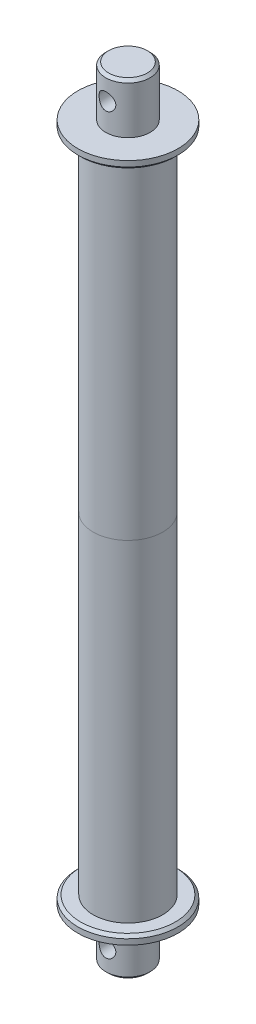
ISO-10303-21;
HEADER;
FILE_DESCRIPTION(('STEP AP214'),'2;1');
FILE_NAME('part.step','',(''),(''),'','','');
FILE_SCHEMA(('AUTOMOTIVE_DESIGN { 1 0 10303 214 1 1 1 1 }'));
ENDSEC;
DATA;
#1=APPLICATION_CONTEXT('core data for automotive mechanical design processes');
#2=APPLICATION_PROTOCOL_DEFINITION('international standard','automotive_design',2000,#1);
#3=PRODUCT_CONTEXT('',#1,'mechanical');
#4=PRODUCT('Part','Part','',(#3));
#5=PRODUCT_RELATED_PRODUCT_CATEGORY('part','',(#4));
#6=PRODUCT_DEFINITION_FORMATION('','',#4);
#7=PRODUCT_DEFINITION_CONTEXT('part definition',#1,'design');
#8=PRODUCT_DEFINITION('design','',#6,#7);
#9=PRODUCT_DEFINITION_SHAPE('','',#8);
#10=(LENGTH_UNIT() NAMED_UNIT(*) SI_UNIT(.MILLI.,.METRE.));
#11=(NAMED_UNIT(*) PLANE_ANGLE_UNIT() SI_UNIT($,.RADIAN.));
#12=(NAMED_UNIT(*) SI_UNIT($,.STERADIAN.) SOLID_ANGLE_UNIT());
#13=UNCERTAINTY_MEASURE_WITH_UNIT(LENGTH_MEASURE(1.E-05),#10,'distance_accuracy_value','');
#14=(GEOMETRIC_REPRESENTATION_CONTEXT(3) GLOBAL_UNCERTAINTY_ASSIGNED_CONTEXT((#13)) GLOBAL_UNIT_ASSIGNED_CONTEXT((#10,
#11,#12)) REPRESENTATION_CONTEXT('',''));
#15=CARTESIAN_POINT('',(0.,0.,0.));
#16=DIRECTION('',(0.,0.,1.));
#17=DIRECTION('',(1.,0.,0.));
#18=AXIS2_PLACEMENT_3D('',#15,#16,#17);
#19=CARTESIAN_POINT('',(0.,-262.,0.));
#20=DIRECTION('',(0.,1.,0.));
#21=DIRECTION('',(0.,0.,-1.));
#22=AXIS2_PLACEMENT_3D('',#19,#20,#21);
#23=CYLINDRICAL_SURFACE('',#22,7.95);
#24=CARTESIAN_POINT('',(0.,-256.7,-7.95));
#25=CARTESIAN_POINT('',(-0.162397491346749,-256.700006155822,-7.95000463305476));
#26=CARTESIAN_POINT('',(-0.324753099848187,-256.686772434708,-7.94498084128038));
#27=CARTESIAN_POINT('',(-0.644608276496751,-256.634404688573,-7.92544254710234));
#28=CARTESIAN_POINT('',(-0.802108607238708,-256.595274752861,-7.91092954315816));
#29=CARTESIAN_POINT('',(-1.10759384707585,-256.49269822242,-7.87396945860854));
#30=CARTESIAN_POINT('',(-1.25559660387506,-256.429298895846,-7.85153780728387));
#31=CARTESIAN_POINT('',(-1.53885384506538,-256.280225253955,-7.80097147100144));
#32=CARTESIAN_POINT('',(-1.67410485143574,-256.194544885329,-7.77283523668181));
#33=CARTESIAN_POINT('',(-1.93382546780258,-255.999501100852,-7.7124114666644));
#34=CARTESIAN_POINT('',(-2.0576753838472,-255.889349562112,-7.68000542519286));
#35=CARTESIAN_POINT('',(-2.28564512635348,-255.650163326245,-7.61527381268037));
#36=CARTESIAN_POINT('',(-2.38975880250598,-255.521122764952,-7.58294826981162));
#37=CARTESIAN_POINT('',(-2.57926636225751,-255.241737456099,-7.52065411531348));
#38=CARTESIAN_POINT('',(-2.66378058319161,-255.09076180509,-7.49082499932832));
#39=CARTESIAN_POINT('',(-2.80594178602416,-254.775437138237,-7.43874757327125));
#40=CARTESIAN_POINT('',(-2.86359965340992,-254.611093572494,-7.41649619275682));
#41=CARTESIAN_POINT('',(-2.94795796885628,-254.280834869077,-7.38336190811873));
#42=CARTESIAN_POINT('',(-2.97584212262489,-254.115266990026,-7.37204616258461));
#43=CARTESIAN_POINT('',(-3.00356228598173,-253.781445139854,-7.36079887492185));
#44=CARTESIAN_POINT('',(-3.00341006762254,-253.613192325772,-7.36086255474267));
#45=CARTESIAN_POINT('',(-2.97596618835097,-253.289655995893,-7.37199408836324));
#46=CARTESIAN_POINT('',(-2.95032311907401,-253.134205352635,-7.38239348387374));
#47=CARTESIAN_POINT('',(-2.87535300460386,-252.830002982662,-7.41191277552078));
#48=CARTESIAN_POINT('',(-2.8260223465669,-252.681252281612,-7.43103400189338));
#49=CARTESIAN_POINT('',(-2.70418189216197,-252.391334929297,-7.47624078591974));
#50=CARTESIAN_POINT('',(-2.63124805334091,-252.250366973954,-7.50245218680416));
#51=CARTESIAN_POINT('',(-2.4645673406646,-251.982194710485,-7.55884475137268));
#52=CARTESIAN_POINT('',(-2.3708132173386,-251.854995219441,-7.58902729628462));
#53=CARTESIAN_POINT('',(-2.15763402761746,-251.608854436917,-7.65246921492573));
#54=CARTESIAN_POINT('',(-2.03689525756286,-251.491066040375,-7.68579812115875));
#55=CARTESIAN_POINT('',(-1.77699753283556,-251.277063734313,-7.75001160096118));
#56=CARTESIAN_POINT('',(-1.63783568074396,-251.180853224796,-7.7808957888236));
#57=CARTESIAN_POINT('',(-1.34207116187379,-251.011444609312,-7.8373678710877));
#58=CARTESIAN_POINT('',(-1.18522721144045,-250.938635034876,-7.86286415320891));
#59=CARTESIAN_POINT('',(-0.860314702000947,-250.820819042114,-7.90500692503182));
#60=CARTESIAN_POINT('',(-0.6922512317537,-250.775800112654,-7.92165739657785));
#61=CARTESIAN_POINT('',(-0.359369733398545,-250.717070324382,-7.94353018166807));
#62=CARTESIAN_POINT('',(-0.194862504077491,-250.701807263327,-7.94931845634064));
#63=CARTESIAN_POINT('',(0.134445660228266,-250.698496926765,-7.95056675753456));
#64=CARTESIAN_POINT('',(0.299246520773493,-250.710443526443,-7.94602910839152));
#65=CARTESIAN_POINT('',(0.617726140759184,-250.760037038119,-7.92750856979343));
#66=CARTESIAN_POINT('',(0.771587980773983,-250.796663171383,-7.91390105530444));
#67=CARTESIAN_POINT('',(1.07087124221814,-250.893227896694,-7.87898797802321));
#68=CARTESIAN_POINT('',(1.21629156356081,-250.95316951938,-7.85768141450416));
#69=CARTESIAN_POINT('',(1.49937620417869,-251.096580931644,-7.8086891601555));
#70=CARTESIAN_POINT('',(1.63668485220485,-251.180693025988,-7.78083372768986));
#71=CARTESIAN_POINT('',(1.89570132393107,-251.369332962027,-7.72181920414049));
#72=CARTESIAN_POINT('',(2.01740330922295,-251.473868407347,-7.6906588846264));
#73=CARTESIAN_POINT('',(2.24923419609776,-251.707613859159,-7.62618977395528));
#74=CARTESIAN_POINT('',(2.35826281750804,-251.837912828914,-7.5928623293951));
#75=CARTESIAN_POINT('',(2.55312943709528,-252.115606919993,-7.52957881379437));
#76=CARTESIAN_POINT('',(2.63896520992051,-252.263003679909,-7.49962306642862));
#77=CARTESIAN_POINT('',(2.78513438407435,-252.572012098931,-7.44658528316189));
#78=CARTESIAN_POINT('',(2.84534845350867,-252.733686127761,-7.42353555585956));
#79=CARTESIAN_POINT('',(2.93729581964044,-253.065993510236,-7.38764350420071));
#80=CARTESIAN_POINT('',(2.96904704082561,-253.236621153564,-7.374794756358));
#81=CARTESIAN_POINT('',(3.00155503802499,-253.570053021797,-7.36161978142478));
#82=CARTESIAN_POINT('',(3.00419110375902,-253.7326455082,-7.36053436127972));
#83=CARTESIAN_POINT('',(2.98321973734044,-254.055827684246,-7.36905868877781));
#84=CARTESIAN_POINT('',(2.95961485946022,-254.216417567282,-7.37866739546335));
#85=CARTESIAN_POINT('',(2.88830176573363,-254.525929360605,-7.40686184253781));
#86=CARTESIAN_POINT('',(2.84137107510192,-254.675059147944,-7.42515720122094));
#87=CARTESIAN_POINT('',(2.72542723369113,-254.963412785519,-7.46849099490141));
#88=CARTESIAN_POINT('',(2.65640846747208,-255.102634105717,-7.49353114436682));
#89=CARTESIAN_POINT('',(2.49401274690989,-255.375226883347,-7.54918066261999));
#90=CARTESIAN_POINT('',(2.39954048534419,-255.50789940309,-7.58001455370614));
#91=CARTESIAN_POINT('',(2.19060617827199,-255.756108052509,-7.64301253026733));
#92=CARTESIAN_POINT('',(2.07613773887328,-255.871638679047,-7.67517703869663));
#93=CARTESIAN_POINT('',(1.82292686694646,-256.088775029514,-7.73934015838431));
#94=CARTESIAN_POINT('',(1.68319475235041,-256.189263396522,-7.7712320684291));
#95=CARTESIAN_POINT('',(1.38770505428977,-256.365304905216,-7.82939530273651));
#96=CARTESIAN_POINT('',(1.23194587961074,-256.440855567874,-7.85566606811619));
#97=CARTESIAN_POINT('',(0.900729443719508,-256.567331659402,-7.90065816243918));
#98=CARTESIAN_POINT('',(0.724682578706471,-256.616880634104,-7.91895015266805));
#99=CARTESIAN_POINT('',(0.365737044740328,-256.683202847218,-7.94361537532247));
#100=CARTESIAN_POINT('',(0.182841976353432,-256.699993069211,-7.94999478368242));
#101=CARTESIAN_POINT('',(0.,-256.7,-7.95));
#102=B_SPLINE_CURVE_WITH_KNOTS('',3,(#24,#25,#26,#27,#28,#29,#30,#31,#32,#33,#34,#35,#36,#37,
#38,#39,#40,#41,#42,#43,#44,#45,#46,#47,#48,#49,#50,#51,#52,#53,#54,#55,#56,#57,#58,#59,#60,#61,
#62,#63,#64,#65,#66,#67,#68,#69,#70,#71,#72,#73,#74,#75,#76,#77,#78,#79,#80,#81,#82,#83,#84,#85,
#86,#87,#88,#89,#90,#91,#92,#93,#94,#95,#96,#97,#98,#99,#100,#101),.UNSPECIFIED.,.T.,.F.,(4,2,2,
2,2,2,2,2,2,2,2,2,2,2,2,2,2,2,2,2,2,2,2,2,2,2,2,2,2,2,2,2,2,2,2,2,2,2,4),(0.,0.486517984474766,
0.97295916052078,1.45845770295974,1.94408828362442,2.44851024997546,2.95308914942897,
3.47718162143793,4.00106148167016,4.503234870572,5.00519740487303,5.47667849204088,
5.94823151260984,6.42877607760174,6.90948822777714,7.42294833461537,7.93648929004924,
8.4581622769326,8.97960023906362,9.47302162836619,9.96633196092748,10.4403977118492,
10.9145251042877,11.4026484582174,11.8909538882842,12.4079529144854,12.9250015290952,
13.4444325927827,13.9635363143255,14.4489214843418,14.9342594114916,15.4044069203737,
15.8746740496894,16.36981560475,16.8651157749309,17.3876947690208,17.9103256964683,
18.4583764326353,19.0061429595388),.UNSPECIFIED.);
#103=CARTESIAN_POINT('',(0.,-256.7,-7.95));
#104=VERTEX_POINT('',#103);
#105=EDGE_CURVE('E77',#104,#104,#102,.T.);
#106=ORIENTED_EDGE('',*,*,#105,.F.);
#107=EDGE_LOOP('',(#106));
#108=FACE_BOUND('',#107,.T.);
#109=CARTESIAN_POINT('',(3.,-253.7,7.36223471508482));
#110=CARTESIAN_POINT('',(2.99998847638603,-253.538180879128,7.36224526269351));
#111=CARTESIAN_POINT('',(2.98684085338451,-253.376210372287,7.36763957602915));
#112=CARTESIAN_POINT('',(2.93479898105657,-253.057258889964,7.38851783959743));
#113=CARTESIAN_POINT('',(2.8959057561269,-252.90027771622,7.40400138838714));
#114=CARTESIAN_POINT('',(2.79402781177854,-252.595869307248,7.44304061076885));
#115=CARTESIAN_POINT('',(2.73110147107099,-252.448419925345,7.46657670963436));
#116=CARTESIAN_POINT('',(2.58314510981221,-252.166120814064,7.51904250584225));
#117=CARTESIAN_POINT('',(2.49810836153358,-252.031274936674,7.54797384408236));
#118=CARTESIAN_POINT('',(2.30376153242718,-251.77121232088,7.60960064181842));
#119=CARTESIAN_POINT('',(2.19351841745458,-251.646719044522,7.64240778971228));
#120=CARTESIAN_POINT('',(1.95386685111476,-251.417477058005,7.70715883050975));
#121=CARTESIAN_POINT('',(1.82445425584251,-251.31273262815,7.73910253499114));
#122=CARTESIAN_POINT('',(1.54463299274319,-251.122462950205,7.79985728918744));
#123=CARTESIAN_POINT('',(1.39365377203541,-251.037725922019,7.82852214322748));
#124=CARTESIAN_POINT('',(1.07830992462712,-250.895154589421,7.87814508841391));
#125=CARTESIAN_POINT('',(0.913950027301738,-250.837310827727,7.89910588822244));
#126=CARTESIAN_POINT('',(0.584118525776004,-250.752710834085,7.93016590252776));
#127=CARTESIAN_POINT('',(0.419008191449067,-250.724708541218,7.9406990457691));
#128=CARTESIAN_POINT('',(0.0861182550130879,-250.696591994262,7.9512752587645));
#129=CARTESIAN_POINT('',(-0.0816604499755092,-250.696468557408,7.95132178261133));
#130=CARTESIAN_POINT('',(-0.406186165059412,-250.723391510091,7.94119442034515));
#131=CARTESIAN_POINT('',(-0.56306480750788,-250.749077333313,7.93153233504782));
#132=CARTESIAN_POINT('',(-0.870095460195533,-250.824598641354,7.90374636952053));
#133=CARTESIAN_POINT('',(-1.02024699260719,-250.874435838686,7.88562188924655));
#134=CARTESIAN_POINT('',(-1.31216781002693,-250.997468038824,7.84237373573117));
#135=CARTESIAN_POINT('',(-1.45378254871369,-251.070993715385,7.81715165701678));
#136=CARTESIAN_POINT('',(-1.72301698371786,-251.239021535831,7.76225605799518));
#137=CARTESIAN_POINT('',(-1.85063211474018,-251.333530492197,7.73258109302015));
#138=CARTESIAN_POINT('',(-2.09625291168491,-251.547378261552,7.66976135047149));
#139=CARTESIAN_POINT('',(-2.21324301273434,-251.667855472786,7.63651515908535));
#140=CARTESIAN_POINT('',(-2.42574456827635,-251.92691204718,7.57169953695763));
#141=CARTESIAN_POINT('',(-2.52125048739725,-252.065496061028,7.54013053993966));
#142=CARTESIAN_POINT('',(-2.69004722792074,-252.360888297443,7.48159976832993));
#143=CARTESIAN_POINT('',(-2.7627839332014,-252.518039077203,7.45475898596922));
#144=CARTESIAN_POINT('',(-2.88037510048301,-252.843639024046,7.41012433225883));
#145=CARTESIAN_POINT('',(-2.92524531348823,-253.012081748807,7.39232535124068));
#146=CARTESIAN_POINT('',(-2.98350497294113,-253.345438628219,7.36899818161272));
#147=CARTESIAN_POINT('',(-2.99850974291805,-253.510026125528,7.36284132147711));
#148=CARTESIAN_POINT('',(-3.0012775017635,-253.83944639009,7.36171480133552));
#149=CARTESIAN_POINT('',(-2.98904742268387,-254.004279084261,7.36674229458981));
#150=CARTESIAN_POINT('',(-2.93915784101862,-254.321162955007,7.38677890427645));
#151=CARTESIAN_POINT('',(-2.90275536170076,-254.473446912731,7.40129408111522));
#152=CARTESIAN_POINT('',(-2.80714040331809,-254.76967282233,7.43808226609779));
#153=CARTESIAN_POINT('',(-2.74792321527996,-254.91361304499,7.46035687570344));
#154=CARTESIAN_POINT('',(-2.60584361626128,-255.195116424026,7.51118902933162));
#155=CARTESIAN_POINT('',(-2.52217223341241,-255.33223304491,7.53995219207521));
#156=CARTESIAN_POINT('',(-2.33441687648243,-255.591052670267,7.60017799915619));
#157=CARTESIAN_POINT('',(-2.2303253503514,-255.712749944663,7.63164163979143));
#158=CARTESIAN_POINT('',(-1.99676156560834,-255.945399927448,7.69616935064396));
#159=CARTESIAN_POINT('',(-1.86608723424952,-256.055157597863,7.72920614910851));
#160=CARTESIAN_POINT('',(-1.5873664361605,-256.251333790744,7.79122096312533));
#161=CARTESIAN_POINT('',(-1.43931986006059,-256.337752166263,7.82019895312222));
#162=CARTESIAN_POINT('',(-1.13009967886562,-256.484247799443,7.87082025135715));
#163=CARTESIAN_POINT('',(-0.968969651016515,-256.544408564079,7.89248676165433));
#164=CARTESIAN_POINT('',(-0.637870931627841,-256.636427307437,7.9261118932038));
#165=CARTESIAN_POINT('',(-0.467906493780563,-256.668298776001,7.9380751412537));
#166=CARTESIAN_POINT('',(-0.134758318572023,-256.7013659427,7.95050234819133));
#167=CARTESIAN_POINT('',(0.0282347182748374,-256.704258772006,7.95160244842512));
#168=CARTESIAN_POINT('',(0.352286714056231,-256.683662690532,7.94384354853882));
#169=CARTESIAN_POINT('',(0.513345908784081,-256.660177029784,7.93498577530464));
#170=CARTESIAN_POINT('',(0.824872903926984,-256.588684897764,7.90859918182994));
#171=CARTESIAN_POINT('',(0.975504704927178,-256.541304891379,7.89129223621013));
#172=CARTESIAN_POINT('',(1.26668938334082,-256.42399525107,7.84981845145297));
#173=CARTESIAN_POINT('',(1.40724034592801,-256.35406134689,7.82565031335173));
#174=CARTESIAN_POINT('',(1.68078304743255,-256.190271019917,7.77159770902848));
#175=CARTESIAN_POINT('',(1.81320405662408,-256.095528280633,7.74151478259926));
#176=CARTESIAN_POINT('',(2.06079145832987,-255.886191784806,7.67932043381079));
#177=CARTESIAN_POINT('',(2.17595163342778,-255.771590907182,7.64720828641126));
#178=CARTESIAN_POINT('',(2.39209703979936,-255.51852576982,7.58246561904029));
#179=CARTESIAN_POINT('',(2.49199147751533,-255.379111604076,7.54989958951667));
#180=CARTESIAN_POINT('',(2.66701047282742,-255.084333982466,7.48987098387787));
#181=CARTESIAN_POINT('',(2.74213185351584,-254.92896848434,7.46240906251266));
#182=CARTESIAN_POINT('',(2.83572851156726,-254.683296007016,7.427133469645));
#183=CARTESIAN_POINT('',(2.86416654860316,-254.597111817032,7.41618073356409));
#184=CARTESIAN_POINT('',(2.91317517775545,-254.422246879659,7.39706747795766));
#185=CARTESIAN_POINT('',(2.93374932570495,-254.333567280146,7.38890569661591));
#186=CARTESIAN_POINT('',(2.96676758310502,-254.154504505493,7.37571079709818));
#187=CARTESIAN_POINT('',(2.97921437058768,-254.064121901617,7.37067664836809));
#188=CARTESIAN_POINT('',(2.99583331277785,-253.882508849827,7.36393584017286));
#189=CARTESIAN_POINT('',(3.00000650021022,-253.791278509158,7.36222876541712));
#190=CARTESIAN_POINT('',(3.,-253.7,7.36223471508482));
#191=B_SPLINE_CURVE_WITH_KNOTS('',3,(#109,#110,#111,#112,#113,#114,#115,#116,#117,#118,#119,
#120,#121,#122,#123,#124,#125,#126,#127,#128,#129,#130,#131,#132,#133,#134,#135,#136,#137,#138,
#139,#140,#141,#142,#143,#144,#145,#146,#147,#148,#149,#150,#151,#152,#153,#154,#155,#156,#157,
#158,#159,#160,#161,#162,#163,#164,#165,#166,#167,#168,#169,#170,#171,#172,#173,#174,#175,#176,
#177,#178,#179,#180,#181,#182,#183,#184,#185,#186,#187,#188,#189,#190),.UNSPECIFIED.,.T.,.F.,(4,
2,2,2,2,2,2,2,2,2,2,2,2,2,2,2,2,2,2,2,2,2,2,2,2,2,2,2,2,2,2,2,2,2,2,2,2,2,2,2,4),(0.,
0.485113019093975,0.970206737092249,1.45412953481373,1.93819975263346,2.44443134249792,
2.95077252559744,3.47459178516768,3.99822669897874,4.49901899995726,4.99964634924538,
5.47519839146572,5.95078415883133,6.43331940839042,6.91601154864107,7.42726811632736,
7.93865625811926,8.46166485432301,8.98437756017796,9.47795435847516,9.97140554165078,
10.4410183842214,10.9107282072142,11.3981880218201,11.885828456347,12.4048427572537,
12.9238603258718,13.4412150191416,13.9583228773832,14.444955850278,14.9315288728514,
15.4059609368032,15.8804828804031,16.3750646117022,16.8698240672408,17.3911057262613,
17.9124542086975,18.1863439084664,18.4601096159644,18.7337850698281,19.0074263609033),.UNSPECIFIED.);
#192=CARTESIAN_POINT('',(3.,-253.7,7.36223471508482));
#193=VERTEX_POINT('',#192);
#194=EDGE_CURVE('E69',#193,#193,#191,.T.);
#195=ORIENTED_EDGE('',*,*,#194,.F.);
#196=EDGE_LOOP('',(#195));
#197=FACE_BOUND('',#196,.T.);
#198=CARTESIAN_POINT('',(0.,-261.,0.));
#199=DIRECTION('',(0.,1.,0.));
#200=DIRECTION('',(0.,0.,1.));
#201=AXIS2_PLACEMENT_3D('',#198,#199,#200);
#202=CIRCLE('',#201,7.95);
#203=CARTESIAN_POINT('',(0.,-261.,7.95));
#204=VERTEX_POINT('',#203);
#205=EDGE_CURVE('E66',#204,#204,#202,.F.);
#206=ORIENTED_EDGE('',*,*,#205,.F.);
#207=EDGE_LOOP('',(#206));
#208=FACE_BOUND('',#207,.T.);
#209=CARTESIAN_POINT('',(0.,-244.,0.));
#210=DIRECTION('',(0.,1.,0.));
#211=DIRECTION('',(0.,0.,1.));
#212=AXIS2_PLACEMENT_3D('',#209,#210,#211);
#213=CIRCLE('',#212,7.95);
#214=CARTESIAN_POINT('',(0.,-244.,7.95));
#215=VERTEX_POINT('',#214);
#216=EDGE_CURVE('E60',#215,#215,#213,.T.);
#217=ORIENTED_EDGE('',*,*,#216,.F.);
#218=EDGE_LOOP('',(#217));
#219=FACE_BOUND('',#218,.T.);
#220=ADVANCED_FACE('F41',(#108,#197,#208,#219),#23,.T.);
#221=CARTESIAN_POINT('',(0.,-262.,0.));
#222=DIRECTION('',(0.,-1.,0.));
#223=DIRECTION('',(0.,0.,1.));
#224=AXIS2_PLACEMENT_3D('',#221,#222,#223);
#225=PLANE('',#224);
#226=CARTESIAN_POINT('',(0.,-262.,0.));
#227=DIRECTION('',(0.,1.,0.));
#228=DIRECTION('',(0.,0.,1.));
#229=AXIS2_PLACEMENT_3D('',#226,#227,#228);
#230=CIRCLE('',#229,6.95);
#231=CARTESIAN_POINT('',(0.,-262.,6.95));
#232=VERTEX_POINT('',#231);
#233=EDGE_CURVE('E63',#232,#232,#230,.T.);
#234=ORIENTED_EDGE('',*,*,#233,.F.);
#235=EDGE_LOOP('',(#234));
#236=FACE_BOUND('',#235,.T.);
#237=ADVANCED_FACE('F87',(#236),#225,.T.);
#238=CARTESIAN_POINT('',(0.,-262.,0.));
#239=DIRECTION('',(0.,1.,0.));
#240=DIRECTION('',(0.,0.,-1.));
#241=AXIS2_PLACEMENT_3D('',#238,#239,#240);
#242=CONICAL_SURFACE('',#241,6.95,0.785398163397444);
#243=ORIENTED_EDGE('',*,*,#205,.T.);
#244=EDGE_LOOP('',(#243));
#245=FACE_BOUND('',#244,.T.);
#246=ORIENTED_EDGE('',*,*,#233,.T.);
#247=EDGE_LOOP('',(#246));
#248=FACE_BOUND('',#247,.T.);
#249=ADVANCED_FACE('F89',(#245,#248),#242,.T.);
#250=CARTESIAN_POINT('',(0.,-253.7,-7.95));
#251=DIRECTION('',(0.,0.,1.));
#252=DIRECTION('',(1.,0.,0.));
#253=AXIS2_PLACEMENT_3D('',#250,#251,#252);
#254=CYLINDRICAL_SURFACE('',#253,3.);
#255=ORIENTED_EDGE('',*,*,#194,.T.);
#256=EDGE_LOOP('',(#255));
#257=FACE_BOUND('',#256,.T.);
#258=ORIENTED_EDGE('',*,*,#105,.T.);
#259=EDGE_LOOP('',(#258));
#260=FACE_BOUND('',#259,.T.);
#261=ADVANCED_FACE('F81',(#257,#260),#254,.F.);
#262=CARTESIAN_POINT('',(0.,-241.,0.));
#263=DIRECTION('',(0.,-1.,0.));
#264=DIRECTION('',(0.,0.,1.));
#265=AXIS2_PLACEMENT_3D('',#262,#263,#264);
#266=CYLINDRICAL_SURFACE('',#265,18.);
#267=CARTESIAN_POINT('',(0.,-242.,0.));
#268=DIRECTION('',(0.,1.,0.));
#269=DIRECTION('',(0.,0.,1.));
#270=AXIS2_PLACEMENT_3D('',#267,#268,#269);
#271=CIRCLE('',#270,18.);
#272=CARTESIAN_POINT('',(0.,-242.,18.));
#273=VERTEX_POINT('',#272);
#274=EDGE_CURVE('E53',#273,#273,#271,.T.);
#275=ORIENTED_EDGE('',*,*,#274,.F.);
#276=EDGE_LOOP('',(#275));
#277=FACE_BOUND('',#276,.T.);
#278=CARTESIAN_POINT('',(0.,-244.,0.));
#279=DIRECTION('',(0.,1.,0.));
#280=DIRECTION('',(0.,0.,1.));
#281=AXIS2_PLACEMENT_3D('',#278,#279,#280);
#282=CIRCLE('',#281,18.);
#283=CARTESIAN_POINT('',(0.,-244.,18.));
#284=VERTEX_POINT('',#283);
#285=EDGE_CURVE('E57',#284,#284,#282,.T.);
#286=ORIENTED_EDGE('',*,*,#285,.T.);
#287=EDGE_LOOP('',(#286));
#288=FACE_BOUND('',#287,.T.);
#289=ADVANCED_FACE('F97',(#277,#288),#266,.T.);
#290=CARTESIAN_POINT('',(0.,-241.,0.));
#291=DIRECTION('',(0.,-1.,0.));
#292=DIRECTION('',(0.,0.,1.));
#293=AXIS2_PLACEMENT_3D('',#290,#291,#292);
#294=PLANE('',#293);
#295=CARTESIAN_POINT('',(0.,-241.,0.));
#296=DIRECTION('',(0.,-1.,0.));
#297=DIRECTION('',(0.,0.,-1.));
#298=AXIS2_PLACEMENT_3D('',#295,#296,#297);
#299=CIRCLE('',#298,12.5);
#300=CARTESIAN_POINT('',(0.,-241.,-12.5));
#301=VERTEX_POINT('',#300);
#302=EDGE_CURVE('E11',#301,#301,#299,.T.);
#303=ORIENTED_EDGE('',*,*,#302,.T.);
#304=EDGE_LOOP('',(#303));
#305=FACE_BOUND('',#304,.T.);
#306=CARTESIAN_POINT('',(0.,-241.,0.));
#307=DIRECTION('',(0.,1.,0.));
#308=DIRECTION('',(0.,0.,1.));
#309=AXIS2_PLACEMENT_3D('',#306,#307,#308);
#310=CIRCLE('',#309,17.);
#311=CARTESIAN_POINT('',(0.,-241.,17.));
#312=VERTEX_POINT('',#311);
#313=EDGE_CURVE('E45',#312,#312,#310,.F.);
#314=ORIENTED_EDGE('',*,*,#313,.F.);
#315=EDGE_LOOP('',(#314));
#316=FACE_BOUND('',#315,.T.);
#317=ADVANCED_FACE('F110',(#305,#316),#294,.F.);
#318=CARTESIAN_POINT('',(0.,-244.,0.));
#319=DIRECTION('',(0.,-1.,0.));
#320=DIRECTION('',(0.,0.,1.));
#321=AXIS2_PLACEMENT_3D('',#318,#319,#320);
#322=PLANE('',#321);
#323=ORIENTED_EDGE('',*,*,#216,.T.);
#324=EDGE_LOOP('',(#323));
#325=FACE_BOUND('',#324,.T.);
#326=ORIENTED_EDGE('',*,*,#285,.F.);
#327=EDGE_LOOP('',(#326));
#328=FACE_BOUND('',#327,.T.);
#329=ADVANCED_FACE('F107',(#325,#328),#322,.T.);
#330=CARTESIAN_POINT('',(0.,-242.,0.));
#331=DIRECTION('',(0.,-1.,0.));
#332=DIRECTION('',(0.,0.,1.));
#333=AXIS2_PLACEMENT_3D('',#330,#331,#332);
#334=CONICAL_SURFACE('',#333,18.,0.78539816339745);
#335=ORIENTED_EDGE('',*,*,#313,.T.);
#336=EDGE_LOOP('',(#335));
#337=FACE_BOUND('',#336,.T.);
#338=ORIENTED_EDGE('',*,*,#274,.T.);
#339=EDGE_LOOP('',(#338));
#340=FACE_BOUND('',#339,.T.);
#341=ADVANCED_FACE('F43',(#337,#340),#334,.T.);
#342=CARTESIAN_POINT('',(0.,-122.,0.));
#343=DIRECTION('',(0.,-1.,0.));
#344=DIRECTION('',(0.,0.,1.));
#345=AXIS2_PLACEMENT_3D('',#342,#343,#344);
#346=CYLINDRICAL_SURFACE('',#345,12.5);
#347=CARTESIAN_POINT('',(0.,-122.,0.));
#348=DIRECTION('',(0.,-1.,0.));
#349=DIRECTION('',(0.,0.,-1.));
#350=AXIS2_PLACEMENT_3D('',#347,#348,#349);
#351=CIRCLE('',#350,12.5);
#352=CARTESIAN_POINT('',(0.,-122.,-12.5));
#353=VERTEX_POINT('',#352);
#354=EDGE_CURVE('E56',#353,#353,#351,.T.);
#355=ORIENTED_EDGE('',*,*,#354,.T.);
#356=EDGE_LOOP('',(#355));
#357=FACE_BOUND('',#356,.T.);
#358=ORIENTED_EDGE('',*,*,#302,.F.);
#359=EDGE_LOOP('',(#358));
#360=FACE_BOUND('',#359,.T.);
#361=ADVANCED_FACE('F122',(#357,#360),#346,.T.);
#362=CARTESIAN_POINT('',(0.,-122.,0.));
#363=DIRECTION('',(0.,1.,0.));
#364=DIRECTION('',(0.,0.,-1.));
#365=AXIS2_PLACEMENT_3D('',#362,#363,#364);
#366=PLANE('',#365);
#367=ORIENTED_EDGE('',*,*,#354,.F.);
#368=EDGE_LOOP('',(#367));
#369=FACE_BOUND('',#368,.T.);
#370=ADVANCED_FACE('F125',(#369),#366,.T.);
#371=CLOSED_SHELL('',(#220,#237,#249,#261,#289,#317,#329,#341,#361,#370));
#372=MANIFOLD_SOLID_BREP('B2',#371);
#373=CARTESIAN_POINT('',(0.,18.,0.));
#374=DIRECTION('',(0.,-1.,0.));
#375=DIRECTION('',(0.,0.,-1.));
#376=AXIS2_PLACEMENT_3D('',#373,#374,#375);
#377=CYLINDRICAL_SURFACE('',#376,7.95);
#378=CARTESIAN_POINT('',(0.,12.7,-7.95));
#379=CARTESIAN_POINT('',(-0.162397491346748,12.7000061558222,-7.95000463305476));
#380=CARTESIAN_POINT('',(-0.324753099848184,12.686772434708,-7.94498084128038));
#381=CARTESIAN_POINT('',(-0.644608276496746,12.6344046885734,-7.92544254710234));
#382=CARTESIAN_POINT('',(-0.802108607238702,12.5952747528614,-7.91092954315817));
#383=CARTESIAN_POINT('',(-1.10759384707584,12.4926982224202,-7.87396945860854));
#384=CARTESIAN_POINT('',(-1.25559660387506,12.4292988958457,-7.85153780728387));
#385=CARTESIAN_POINT('',(-1.53885384506537,12.2802252539554,-7.80097147100144));
#386=CARTESIAN_POINT('',(-1.67410485143574,12.1945448853293,-7.77283523668182));
#387=CARTESIAN_POINT('',(-1.93382546780257,11.9995011008524,-7.71241146666441));
#388=CARTESIAN_POINT('',(-2.05767538384719,11.8893495621118,-7.68000542519286));
#389=CARTESIAN_POINT('',(-2.28564512635348,11.6501633262448,-7.61527381268037));
#390=CARTESIAN_POINT('',(-2.38975880250598,11.5211227649516,-7.58294826981162));
#391=CARTESIAN_POINT('',(-2.57926636225751,11.2417374560993,-7.52065411531348));
#392=CARTESIAN_POINT('',(-2.6637805831916,11.0907618050901,-7.49082499932832));
#393=CARTESIAN_POINT('',(-2.80594178602416,10.7754371382371,-7.43874757327125));
#394=CARTESIAN_POINT('',(-2.86359965340992,10.611093572494,-7.41649619275682));
#395=CARTESIAN_POINT('',(-2.94795796885627,10.2808348690774,-7.38336190811873));
#396=CARTESIAN_POINT('',(-2.97584212262488,10.115266990026,-7.37204616258461));
#397=CARTESIAN_POINT('',(-3.00356228598173,9.7814451398545,-7.36079887492185));
#398=CARTESIAN_POINT('',(-3.00341006762254,9.61319232577162,-7.36086255474267));
#399=CARTESIAN_POINT('',(-2.97596618835097,9.28965599589298,-7.37199408836324));
#400=CARTESIAN_POINT('',(-2.950323119074,9.13420535263497,-7.38239348387374));
#401=CARTESIAN_POINT('',(-2.87535300460385,8.83000298266155,-7.41191277552078));
#402=CARTESIAN_POINT('',(-2.8260223465669,8.68125228161165,-7.43103400189338));
#403=CARTESIAN_POINT('',(-2.70418189216197,8.39133492929746,-7.47624078591974));
#404=CARTESIAN_POINT('',(-2.6312480533409,8.2503669739539,-7.50245218680417));
#405=CARTESIAN_POINT('',(-2.46456734066459,7.98219471048518,-7.55884475137268));
#406=CARTESIAN_POINT('',(-2.3708132173386,7.8549952194409,-7.58902729628462));
#407=CARTESIAN_POINT('',(-2.15763402761747,7.60885443691731,-7.65246921492573));
#408=CARTESIAN_POINT('',(-2.03689525756286,7.49106604037545,-7.68579812115875));
#409=CARTESIAN_POINT('',(-1.77699753283556,7.27706373431274,-7.75001160096118));
#410=CARTESIAN_POINT('',(-1.63783568074396,7.18085322479597,-7.78089578882361));
#411=CARTESIAN_POINT('',(-1.34207116187379,7.01144460931163,-7.8373678710877));
#412=CARTESIAN_POINT('',(-1.18522721144044,6.93863503487575,-7.86286415320891));
#413=CARTESIAN_POINT('',(-0.86031470200094,6.82081904211372,-7.90500692503182));
#414=CARTESIAN_POINT('',(-0.692251231753698,6.77580011265377,-7.92165739657785));
#415=CARTESIAN_POINT('',(-0.359369733398546,6.71707032438193,-7.94353018166807));
#416=CARTESIAN_POINT('',(-0.19486250407749,6.70180726332692,-7.94931845634064));
#417=CARTESIAN_POINT('',(0.134445660228267,6.69849692676496,-7.95056675753456));
#418=CARTESIAN_POINT('',(0.299246520773491,6.71044352644258,-7.94602910839152));
#419=CARTESIAN_POINT('',(0.617726140759181,6.76003703811891,-7.92750856979343));
#420=CARTESIAN_POINT('',(0.771587980773982,6.79666317138276,-7.91390105530444));
#421=CARTESIAN_POINT('',(1.07087124221814,6.89322789669408,-7.87898797802321));
#422=CARTESIAN_POINT('',(1.21629156356081,6.95316951937971,-7.85768141450416));
#423=CARTESIAN_POINT('',(1.49937620417867,7.09658093164373,-7.8086891601555));
#424=CARTESIAN_POINT('',(1.63668485220481,7.18069302598826,-7.78083372768987));
#425=CARTESIAN_POINT('',(1.89570132393103,7.36933296202654,-7.7218192041405));
#426=CARTESIAN_POINT('',(2.01740330922294,7.47386840734707,-7.6906588846264));
#427=CARTESIAN_POINT('',(2.24923419609776,7.70761385915857,-7.62618977395529));
#428=CARTESIAN_POINT('',(2.35826281750802,7.83791282891418,-7.59286232939511));
#429=CARTESIAN_POINT('',(2.55312943709526,8.1156069199928,-7.52957881379437));
#430=CARTESIAN_POINT('',(2.63896520992051,8.26300367990923,-7.49962306642862));
#431=CARTESIAN_POINT('',(2.78513438407435,8.57201209893149,-7.44658528316189));
#432=CARTESIAN_POINT('',(2.84534845350868,8.733686127761,-7.42353555585956));
#433=CARTESIAN_POINT('',(2.93729581964043,9.06599351023611,-7.38764350420071));
#434=CARTESIAN_POINT('',(2.96904704082561,9.23662115356447,-7.374794756358));
#435=CARTESIAN_POINT('',(3.00155503802499,9.57005302179686,-7.36161978142478));
#436=CARTESIAN_POINT('',(3.00419110375903,9.73264550820018,-7.36053436127972));
#437=CARTESIAN_POINT('',(2.98321973734044,10.0558276842463,-7.36905868877781));
#438=CARTESIAN_POINT('',(2.95961485946022,10.2164175672823,-7.37866739546335));
#439=CARTESIAN_POINT('',(2.88830176573362,10.5259293606051,-7.40686184253781));
#440=CARTESIAN_POINT('',(2.84137107510192,10.6750591479437,-7.42515720122094));
#441=CARTESIAN_POINT('',(2.72542723369112,10.963412785519,-7.46849099490141));
#442=CARTESIAN_POINT('',(2.65640846747208,11.1026341057172,-7.49353114436682));
#443=CARTESIAN_POINT('',(2.4940127469099,11.375226883347,-7.54918066261999));
#444=CARTESIAN_POINT('',(2.39954048534419,11.5078994030905,-7.58001455370614));
#445=CARTESIAN_POINT('',(2.19060617827199,11.7561080525092,-7.64301253026733));
#446=CARTESIAN_POINT('',(2.07613773887328,11.8716386790474,-7.67517703869663));
#447=CARTESIAN_POINT('',(1.82292686694646,12.0887750295145,-7.73934015838431));
#448=CARTESIAN_POINT('',(1.68319475235042,12.1892633965218,-7.7712320684291));
#449=CARTESIAN_POINT('',(1.38770505428977,12.365304905216,-7.82939530273651));
#450=CARTESIAN_POINT('',(1.23194587961074,12.4408555678737,-7.85566606811619));
#451=CARTESIAN_POINT('',(0.900729443719499,12.5673316594021,-7.90065816243918));
#452=CARTESIAN_POINT('',(0.72468257870646,12.6168806341044,-7.91895015266806));
#453=CARTESIAN_POINT('',(0.36573704474032,12.6832028472176,-7.94361537532247));
#454=CARTESIAN_POINT('',(0.182841976353428,12.6999930692113,-7.94999478368242));
#455=CARTESIAN_POINT('',(0.,12.7,-7.95));
#456=B_SPLINE_CURVE_WITH_KNOTS('',3,(#378,#379,#380,#381,#382,#383,#384,#385,#386,#387,#388,
#389,#390,#391,#392,#393,#394,#395,#396,#397,#398,#399,#400,#401,#402,#403,#404,#405,#406,#407,
#408,#409,#410,#411,#412,#413,#414,#415,#416,#417,#418,#419,#420,#421,#422,#423,#424,#425,#426,
#427,#428,#429,#430,#431,#432,#433,#434,#435,#436,#437,#438,#439,#440,#441,#442,#443,#444,#445,
#446,#447,#448,#449,#450,#451,#452,#453,#454,#455),.UNSPECIFIED.,.T.,.F.,(4,2,2,2,2,2,2,2,2,2,2,
2,2,2,2,2,2,2,2,2,2,2,2,2,2,2,2,2,2,2,2,2,2,2,2,2,2,2,4),(0.,0.486517984474757,
0.972959160520783,1.45845770295972,1.94408828362444,2.44851024997547,2.95308914942897,
3.47718162143792,4.00106148167018,4.50323487057201,5.00519740487303,5.47667849204093,
5.94823151260985,6.42877607760176,6.90948822777715,7.42294833461538,7.93648929004924,
8.45816227693261,8.97960023906363,9.4730216283662,9.96633196092749,10.4403977118492,
10.9145251042877,11.4026484582173,11.8909538882842,12.4079529144854,12.9250015290952,
13.4444325927827,13.9635363143255,14.4489214843418,14.9342594114916,15.4044069203738,
15.8746740496895,16.36981560475,16.8651157749309,17.3876947690209,17.9103256964684,
18.4583764326353,19.0061429595389),.UNSPECIFIED.);
#457=CARTESIAN_POINT('',(0.,12.7,-7.95));
#458=VERTEX_POINT('',#457);
#459=EDGE_CURVE('E240',#458,#458,#456,.T.);
#460=ORIENTED_EDGE('',*,*,#459,.T.);
#461=EDGE_LOOP('',(#460));
#462=FACE_BOUND('',#461,.T.);
#463=CARTESIAN_POINT('',(3.,9.7,7.36223471508482));
#464=CARTESIAN_POINT('',(2.99998847638603,9.53818087912798,7.36224526269351));
#465=CARTESIAN_POINT('',(2.9868408533845,9.3762103722872,7.36763957602915));
#466=CARTESIAN_POINT('',(2.93479898105657,9.05725888996367,7.38851783959744));
#467=CARTESIAN_POINT('',(2.89590575612689,8.90027771621983,7.40400138838714));
#468=CARTESIAN_POINT('',(2.79402781177854,8.59586930724842,7.44304061076884));
#469=CARTESIAN_POINT('',(2.731101471071,8.44841992534473,7.46657670963436));
#470=CARTESIAN_POINT('',(2.58314510981222,8.16612081406447,7.51904250584225));
#471=CARTESIAN_POINT('',(2.49810836153358,8.03127493667398,7.54797384408236));
#472=CARTESIAN_POINT('',(2.30376153242717,7.77121232087998,7.60960064181843));
#473=CARTESIAN_POINT('',(2.19351841745457,7.64671904452181,7.64240778971228));
#474=CARTESIAN_POINT('',(1.95386685111475,7.41747705800545,7.70715883050975));
#475=CARTESIAN_POINT('',(1.82445425584252,7.31273262815022,7.73910253499114));
#476=CARTESIAN_POINT('',(1.5446329927432,7.12246295020474,7.79985728918744));
#477=CARTESIAN_POINT('',(1.3936537720354,7.03772592201908,7.82852214322748));
#478=CARTESIAN_POINT('',(1.07830992462711,6.89515458942065,7.87814508841391));
#479=CARTESIAN_POINT('',(0.913950027301735,6.83731082772747,7.89910588822244));
#480=CARTESIAN_POINT('',(0.584118525776006,6.75271083408455,7.93016590252776));
#481=CARTESIAN_POINT('',(0.419008191449069,6.72470854121812,7.9406990457691));
#482=CARTESIAN_POINT('',(0.0861182550130894,6.69659199426228,7.9512752587645));
#483=CARTESIAN_POINT('',(-0.0816604499755095,6.69646855740847,7.95132178261133));
#484=CARTESIAN_POINT('',(-0.406186165059413,6.7233915100908,7.94119442034515));
#485=CARTESIAN_POINT('',(-0.563064807507878,6.74907733331319,7.93153233504782));
#486=CARTESIAN_POINT('',(-0.870095460195534,6.82459864135385,7.90374636952053));
#487=CARTESIAN_POINT('',(-1.02024699260719,6.87443583868587,7.88562188924655));
#488=CARTESIAN_POINT('',(-1.31216781002694,6.9974680388243,7.84237373573117));
#489=CARTESIAN_POINT('',(-1.45378254871369,7.07099371538483,7.81715165701678));
#490=CARTESIAN_POINT('',(-1.72301698371786,7.23902153583117,7.76225605799518));
#491=CARTESIAN_POINT('',(-1.85063211474019,7.33353049219717,7.73258109302015));
#492=CARTESIAN_POINT('',(-2.09625291168491,7.54737826155229,7.66976135047149));
#493=CARTESIAN_POINT('',(-2.2132430127343,7.66785547278632,7.63651515908535));
#494=CARTESIAN_POINT('',(-2.42574456827632,7.92691204717986,7.57169953695764));
#495=CARTESIAN_POINT('',(-2.52125048739725,8.06549606102768,7.54013053993966));
#496=CARTESIAN_POINT('',(-2.69004722792075,8.36088829744311,7.48159976832992));
#497=CARTESIAN_POINT('',(-2.76278393320141,8.51803907720284,7.45475898596922));
#498=CARTESIAN_POINT('',(-2.880375100483,8.84363902404656,7.41012433225883));
#499=CARTESIAN_POINT('',(-2.92524531348823,9.0120817488069,7.39232535124068));
#500=CARTESIAN_POINT('',(-2.98350497294114,9.34543862821912,7.36899818161272));
#501=CARTESIAN_POINT('',(-2.99850974291805,9.51002612552786,7.36284132147711));
#502=CARTESIAN_POINT('',(-3.00127750176349,9.83944639008965,7.36171480133552));
#503=CARTESIAN_POINT('',(-2.98904742268387,10.0042790842612,7.36674229458981));
#504=CARTESIAN_POINT('',(-2.93915784101862,10.3211629550074,7.38677890427645));
#505=CARTESIAN_POINT('',(-2.90275536170076,10.4734469127311,7.40129408111521));
#506=CARTESIAN_POINT('',(-2.80714040331809,10.7696728223296,7.43808226609779));
#507=CARTESIAN_POINT('',(-2.74792321527995,10.9136130449902,7.46035687570344));
#508=CARTESIAN_POINT('',(-2.60584361626127,11.1951164240263,7.51118902933162));
#509=CARTESIAN_POINT('',(-2.5221722334124,11.3322330449096,7.53995219207521));
#510=CARTESIAN_POINT('',(-2.33441687648243,11.5910526702668,7.60017799915619));
#511=CARTESIAN_POINT('',(-2.2303253503514,11.7127499446626,7.63164163979143));
#512=CARTESIAN_POINT('',(-1.99676156560833,11.9453999274485,7.69616935064396));
#513=CARTESIAN_POINT('',(-1.86608723424952,12.055157597863,7.72920614910852));
#514=CARTESIAN_POINT('',(-1.5873664361605,12.2513337907439,7.79122096312534));
#515=CARTESIAN_POINT('',(-1.43931986006059,12.3377521662627,7.82019895312222));
#516=CARTESIAN_POINT('',(-1.13009967886562,12.4842477994431,7.87082025135715));
#517=CARTESIAN_POINT('',(-0.968969651016516,12.5444085640794,7.89248676165433));
#518=CARTESIAN_POINT('',(-0.637870931627841,12.6364273074365,7.9261118932038));
#519=CARTESIAN_POINT('',(-0.467906493780563,12.6682987760011,7.9380751412537));
#520=CARTESIAN_POINT('',(-0.134758318572021,12.7013659427001,7.95050234819133));
#521=CARTESIAN_POINT('',(0.0282347182748412,12.7042587720064,7.95160244842512));
#522=CARTESIAN_POINT('',(0.352286714056232,12.6836626905325,7.94384354853882));
#523=CARTESIAN_POINT('',(0.513345908784079,12.6601770297837,7.93498577530464));
#524=CARTESIAN_POINT('',(0.824872903926982,12.5886848977638,7.90859918182994));
#525=CARTESIAN_POINT('',(0.975504704927181,12.5413048913794,7.89129223621013));
#526=CARTESIAN_POINT('',(1.26668938334082,12.4239952510697,7.84981845145297));
#527=CARTESIAN_POINT('',(1.407240345928,12.3540613468895,7.82565031335174));
#528=CARTESIAN_POINT('',(1.68078304743255,12.1902710199168,7.77159770902848));
#529=CARTESIAN_POINT('',(1.81320405662409,12.0955282806332,7.74151478259925));
#530=CARTESIAN_POINT('',(2.06079145832988,11.886191784806,7.67932043381079));
#531=CARTESIAN_POINT('',(2.17595163342778,11.7715909071818,7.64720828641126));
#532=CARTESIAN_POINT('',(2.39209703979936,11.5185257698201,7.58246561904029));
#533=CARTESIAN_POINT('',(2.49199147751535,11.3791116040763,7.54989958951667));
#534=CARTESIAN_POINT('',(2.66701047282742,11.0843339824656,7.48987098387787));
#535=CARTESIAN_POINT('',(2.74213185351583,10.9289684843405,7.46240906251267));
#536=CARTESIAN_POINT('',(2.83572851156726,10.6832960070156,7.427133469645));
#537=CARTESIAN_POINT('',(2.86416654860317,10.5971118170317,7.41618073356408));
#538=CARTESIAN_POINT('',(2.91317517775546,10.4222468796589,7.39706747795765));
#539=CARTESIAN_POINT('',(2.93374932570495,10.3335672801464,7.38890569661591));
#540=CARTESIAN_POINT('',(2.96676758310502,10.1545045054933,7.37571079709818));
#541=CARTESIAN_POINT('',(2.97921437058769,10.0641219016166,7.37067664836809));
#542=CARTESIAN_POINT('',(2.99583331277785,9.88250884982683,7.36393584017285));
#543=CARTESIAN_POINT('',(3.00000650021022,9.79127850915807,7.36222876541712));
#544=CARTESIAN_POINT('',(3.,9.7,7.36223471508482));
#545=B_SPLINE_CURVE_WITH_KNOTS('',3,(#463,#464,#465,#466,#467,#468,#469,#470,#471,#472,#473,
#474,#475,#476,#477,#478,#479,#480,#481,#482,#483,#484,#485,#486,#487,#488,#489,#490,#491,#492,
#493,#494,#495,#496,#497,#498,#499,#500,#501,#502,#503,#504,#505,#506,#507,#508,#509,#510,#511,
#512,#513,#514,#515,#516,#517,#518,#519,#520,#521,#522,#523,#524,#525,#526,#527,#528,#529,#530,
#531,#532,#533,#534,#535,#536,#537,#538,#539,#540,#541,#542,#543,#544),.UNSPECIFIED.,.T.,.F.,(4,
2,2,2,2,2,2,2,2,2,2,2,2,2,2,2,2,2,2,2,2,2,2,2,2,2,2,2,2,2,2,2,2,2,2,2,2,2,2,2,4),(0.,
0.485113019094003,0.97020673709227,1.45412953481374,1.93819975263346,2.44443134249792,
2.95077252559746,3.47459178516768,3.99822669897873,4.49901899995725,4.99964634924538,
5.47519839146572,5.95078415883133,6.43331940839045,6.91601154864105,7.42726811632732,
7.93865625811923,8.46166485432304,8.98437756017793,9.47795435847515,9.97140554165079,
10.4410183842214,10.9107282072142,11.3981880218201,11.885828456347,12.4048427572537,
12.9238603258718,13.4412150191416,13.9583228773832,14.444955850278,14.9315288728514,
15.4059609368032,15.8804828804031,16.3750646117023,16.8698240672408,17.3911057262614,
17.9124542086976,18.1863439084664,18.4601096159644,18.7337850698281,19.0074263609033),.UNSPECIFIED.);
#546=CARTESIAN_POINT('',(3.,9.7,7.36223471508482));
#547=VERTEX_POINT('',#546);
#548=EDGE_CURVE('E232',#547,#547,#545,.T.);
#549=ORIENTED_EDGE('',*,*,#548,.T.);
#550=EDGE_LOOP('',(#549));
#551=FACE_BOUND('',#550,.T.);
#552=CARTESIAN_POINT('',(0.,17.,0.));
#553=DIRECTION('',(0.,1.,0.));
#554=DIRECTION('',(0.,0.,1.));
#555=AXIS2_PLACEMENT_3D('',#552,#553,#554);
#556=CIRCLE('',#555,7.95);
#557=CARTESIAN_POINT('',(0.,17.,7.95));
#558=VERTEX_POINT('',#557);
#559=EDGE_CURVE('E229',#558,#558,#556,.F.);
#560=ORIENTED_EDGE('',*,*,#559,.T.);
#561=EDGE_LOOP('',(#560));
#562=FACE_BOUND('',#561,.T.);
#563=CARTESIAN_POINT('',(0.,0.,0.));
#564=DIRECTION('',(0.,1.,0.));
#565=DIRECTION('',(0.,0.,1.));
#566=AXIS2_PLACEMENT_3D('',#563,#564,#565);
#567=CIRCLE('',#566,7.95);
#568=CARTESIAN_POINT('',(0.,0.,7.95));
#569=VERTEX_POINT('',#568);
#570=EDGE_CURVE('E223',#569,#569,#567,.T.);
#571=ORIENTED_EDGE('',*,*,#570,.T.);
#572=EDGE_LOOP('',(#571));
#573=FACE_BOUND('',#572,.T.);
#574=ADVANCED_FACE('F203',(#462,#551,#562,#573),#377,.T.);
#575=CARTESIAN_POINT('',(0.,18.,0.));
#576=DIRECTION('',(0.,1.,0.));
#577=DIRECTION('',(0.,0.,1.));
#578=AXIS2_PLACEMENT_3D('',#575,#576,#577);
#579=PLANE('',#578);
#580=CARTESIAN_POINT('',(0.,18.,0.));
#581=DIRECTION('',(0.,1.,0.));
#582=DIRECTION('',(0.,0.,1.));
#583=AXIS2_PLACEMENT_3D('',#580,#581,#582);
#584=CIRCLE('',#583,6.95);
#585=CARTESIAN_POINT('',(0.,18.,6.95));
#586=VERTEX_POINT('',#585);
#587=EDGE_CURVE('E226',#586,#586,#584,.T.);
#588=ORIENTED_EDGE('',*,*,#587,.T.);
#589=EDGE_LOOP('',(#588));
#590=FACE_BOUND('',#589,.T.);
#591=ADVANCED_FACE('F254',(#590),#579,.T.);
#592=CARTESIAN_POINT('',(0.,18.,0.));
#593=DIRECTION('',(0.,-1.,0.));
#594=DIRECTION('',(0.,0.,-1.));
#595=AXIS2_PLACEMENT_3D('',#592,#593,#594);
#596=CONICAL_SURFACE('',#595,6.95,0.785398163397444);
#597=ORIENTED_EDGE('',*,*,#559,.F.);
#598=EDGE_LOOP('',(#597));
#599=FACE_BOUND('',#598,.T.);
#600=ORIENTED_EDGE('',*,*,#587,.F.);
#601=EDGE_LOOP('',(#600));
#602=FACE_BOUND('',#601,.T.);
#603=ADVANCED_FACE('F251',(#599,#602),#596,.T.);
#604=CARTESIAN_POINT('',(0.,9.7,-7.95));
#605=DIRECTION('',(0.,0.,1.));
#606=DIRECTION('',(1.,0.,0.));
#607=AXIS2_PLACEMENT_3D('',#604,#605,#606);
#608=CYLINDRICAL_SURFACE('',#607,3.);
#609=ORIENTED_EDGE('',*,*,#548,.F.);
#610=EDGE_LOOP('',(#609));
#611=FACE_BOUND('',#610,.T.);
#612=ORIENTED_EDGE('',*,*,#459,.F.);
#613=EDGE_LOOP('',(#612));
#614=FACE_BOUND('',#613,.T.);
#615=ADVANCED_FACE('F246',(#611,#614),#608,.F.);
#616=CARTESIAN_POINT('',(0.,-3.,0.));
#617=DIRECTION('',(0.,1.,0.));
#618=DIRECTION('',(0.,0.,1.));
#619=AXIS2_PLACEMENT_3D('',#616,#617,#618);
#620=CYLINDRICAL_SURFACE('',#619,18.);
#621=CARTESIAN_POINT('',(0.,-2.,0.));
#622=DIRECTION('',(0.,1.,0.));
#623=DIRECTION('',(0.,0.,1.));
#624=AXIS2_PLACEMENT_3D('',#621,#622,#623);
#625=CIRCLE('',#624,18.);
#626=CARTESIAN_POINT('',(0.,-2.,18.));
#627=VERTEX_POINT('',#626);
#628=EDGE_CURVE('E216',#627,#627,#625,.T.);
#629=ORIENTED_EDGE('',*,*,#628,.T.);
#630=EDGE_LOOP('',(#629));
#631=FACE_BOUND('',#630,.T.);
#632=CARTESIAN_POINT('',(0.,0.,0.));
#633=DIRECTION('',(0.,1.,0.));
#634=DIRECTION('',(0.,0.,1.));
#635=AXIS2_PLACEMENT_3D('',#632,#633,#634);
#636=CIRCLE('',#635,18.);
#637=CARTESIAN_POINT('',(0.,0.,18.));
#638=VERTEX_POINT('',#637);
#639=EDGE_CURVE('E220',#638,#638,#636,.T.);
#640=ORIENTED_EDGE('',*,*,#639,.F.);
#641=EDGE_LOOP('',(#640));
#642=FACE_BOUND('',#641,.T.);
#643=ADVANCED_FACE('F250',(#631,#642),#620,.T.);
#644=CARTESIAN_POINT('',(0.,-3.,0.));
#645=DIRECTION('',(0.,1.,0.));
#646=DIRECTION('',(0.,0.,1.));
#647=AXIS2_PLACEMENT_3D('',#644,#645,#646);
#648=PLANE('',#647);
#649=CARTESIAN_POINT('',(0.,-3.,0.));
#650=DIRECTION('',(0.,-1.,0.));
#651=DIRECTION('',(0.,0.,-1.));
#652=AXIS2_PLACEMENT_3D('',#649,#650,#651);
#653=CIRCLE('',#652,12.5);
#654=CARTESIAN_POINT('',(0.,-3.,-12.5));
#655=VERTEX_POINT('',#654);
#656=EDGE_CURVE('E40',#655,#655,#653,.T.);
#657=ORIENTED_EDGE('',*,*,#656,.F.);
#658=EDGE_LOOP('',(#657));
#659=FACE_BOUND('',#658,.T.);
#660=CARTESIAN_POINT('',(0.,-3.,0.));
#661=DIRECTION('',(0.,1.,0.));
#662=DIRECTION('',(0.,0.,1.));
#663=AXIS2_PLACEMENT_3D('',#660,#661,#662);
#664=CIRCLE('',#663,17.);
#665=CARTESIAN_POINT('',(0.,-3.,17.));
#666=VERTEX_POINT('',#665);
#667=EDGE_CURVE('E208',#666,#666,#664,.F.);
#668=ORIENTED_EDGE('',*,*,#667,.T.);
#669=EDGE_LOOP('',(#668));
#670=FACE_BOUND('',#669,.T.);
#671=ADVANCED_FACE('F280',(#659,#670),#648,.F.);
#672=CARTESIAN_POINT('',(0.,0.,0.));
#673=DIRECTION('',(0.,1.,0.));
#674=DIRECTION('',(0.,0.,1.));
#675=AXIS2_PLACEMENT_3D('',#672,#673,#674);
#676=PLANE('',#675);
#677=ORIENTED_EDGE('',*,*,#570,.F.);
#678=EDGE_LOOP('',(#677));
#679=FACE_BOUND('',#678,.T.);
#680=ORIENTED_EDGE('',*,*,#639,.T.);
#681=EDGE_LOOP('',(#680));
#682=FACE_BOUND('',#681,.T.);
#683=ADVANCED_FACE('F277',(#679,#682),#676,.T.);
#684=CARTESIAN_POINT('',(0.,-2.,0.));
#685=DIRECTION('',(0.,1.,0.));
#686=DIRECTION('',(0.,0.,1.));
#687=AXIS2_PLACEMENT_3D('',#684,#685,#686);
#688=CONICAL_SURFACE('',#687,18.,0.78539816339745);
#689=ORIENTED_EDGE('',*,*,#667,.F.);
#690=EDGE_LOOP('',(#689));
#691=FACE_BOUND('',#690,.T.);
#692=ORIENTED_EDGE('',*,*,#628,.F.);
#693=EDGE_LOOP('',(#692));
#694=FACE_BOUND('',#693,.T.);
#695=ADVANCED_FACE('F206',(#691,#694),#688,.T.);
#696=CARTESIAN_POINT('',(0.,-122.,0.));
#697=DIRECTION('',(0.,1.,0.));
#698=DIRECTION('',(0.,0.,1.));
#699=AXIS2_PLACEMENT_3D('',#696,#697,#698);
#700=CYLINDRICAL_SURFACE('',#699,12.5);
#701=CARTESIAN_POINT('',(0.,-122.,0.));
#702=DIRECTION('',(0.,-1.,0.));
#703=DIRECTION('',(0.,0.,-1.));
#704=AXIS2_PLACEMENT_3D('',#701,#702,#703);
#705=CIRCLE('',#704,12.5);
#706=CARTESIAN_POINT('',(0.,-122.,-12.5));
#707=VERTEX_POINT('',#706);
#708=EDGE_CURVE('E219',#707,#707,#705,.T.);
#709=ORIENTED_EDGE('',*,*,#708,.F.);
#710=EDGE_LOOP('',(#709));
#711=FACE_BOUND('',#710,.T.);
#712=ORIENTED_EDGE('',*,*,#656,.T.);
#713=EDGE_LOOP('',(#712));
#714=FACE_BOUND('',#713,.T.);
#715=ADVANCED_FACE('F294',(#711,#714),#700,.T.);
#716=CARTESIAN_POINT('',(0.,-122.,0.));
#717=DIRECTION('',(0.,-1.,0.));
#718=DIRECTION('',(0.,0.,-1.));
#719=AXIS2_PLACEMENT_3D('',#716,#717,#718);
#720=PLANE('',#719);
#721=ORIENTED_EDGE('',*,*,#708,.T.);
#722=EDGE_LOOP('',(#721));
#723=FACE_BOUND('',#722,.T.);
#724=ADVANCED_FACE('F299',(#723),#720,.T.);
#725=CLOSED_SHELL('',(#574,#591,#603,#615,#643,#671,#683,#695,#715,#724));
#726=MANIFOLD_SOLID_BREP('B6',#725);
#727=ADVANCED_BREP_SHAPE_REPRESENTATION('',(#18,#372,#726),#14);
#728=SHAPE_DEFINITION_REPRESENTATION(#9,#727);
ENDSEC;
END-ISO-10303-21;
